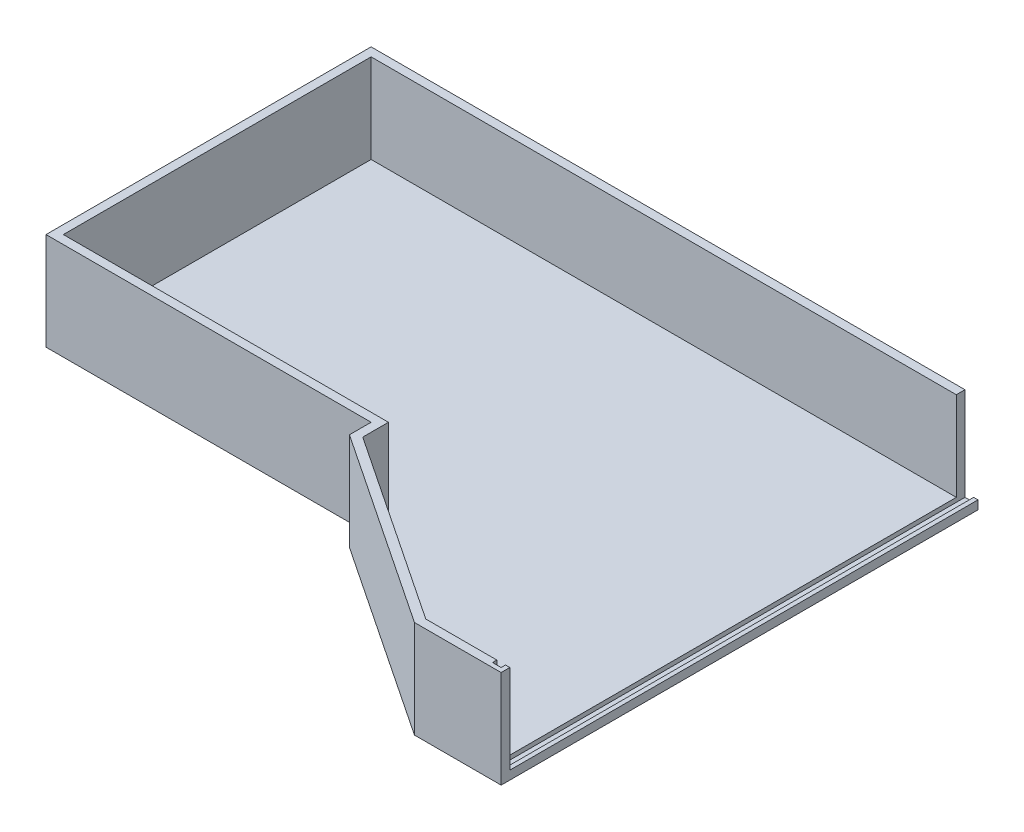
ISO-10303-21;
HEADER;
FILE_DESCRIPTION(('STEP AP214'),'2;1');
FILE_NAME('part.step','',(''),(''),'','','');
FILE_SCHEMA(('AUTOMOTIVE_DESIGN { 1 0 10303 214 1 1 1 1 }'));
ENDSEC;
DATA;
#1=APPLICATION_CONTEXT('core data for automotive mechanical design processes');
#2=APPLICATION_PROTOCOL_DEFINITION('international standard','automotive_design',2000,#1);
#3=PRODUCT_CONTEXT('',#1,'mechanical');
#4=PRODUCT('Part','Part','',(#3));
#5=PRODUCT_RELATED_PRODUCT_CATEGORY('part','',(#4));
#6=PRODUCT_DEFINITION_FORMATION('','',#4);
#7=PRODUCT_DEFINITION_CONTEXT('part definition',#1,'design');
#8=PRODUCT_DEFINITION('design','',#6,#7);
#9=PRODUCT_DEFINITION_SHAPE('','',#8);
#10=(LENGTH_UNIT() NAMED_UNIT(*) SI_UNIT(.MILLI.,.METRE.));
#11=(NAMED_UNIT(*) PLANE_ANGLE_UNIT() SI_UNIT($,.RADIAN.));
#12=(NAMED_UNIT(*) SI_UNIT($,.STERADIAN.) SOLID_ANGLE_UNIT());
#13=UNCERTAINTY_MEASURE_WITH_UNIT(LENGTH_MEASURE(1.E-05),#10,'distance_accuracy_value','');
#14=(GEOMETRIC_REPRESENTATION_CONTEXT(3) GLOBAL_UNCERTAINTY_ASSIGNED_CONTEXT((#13)) GLOBAL_UNIT_ASSIGNED_CONTEXT((#10,
#11,#12)) REPRESENTATION_CONTEXT('',''));
#15=CARTESIAN_POINT('',(0.,0.,0.));
#16=DIRECTION('',(0.,0.,1.));
#17=DIRECTION('',(1.,0.,0.));
#18=AXIS2_PLACEMENT_3D('',#15,#16,#17);
#19=CARTESIAN_POINT('',(0.,2.,0.));
#20=DIRECTION('',(0.,1.,0.));
#21=DIRECTION('',(0.,0.,1.));
#22=AXIS2_PLACEMENT_3D('',#19,#20,#21);
#23=PLANE('',#22);
#24=DIRECTION('',(0.,0.,-1.));
#25=VECTOR('',#24,1.);
#26=CARTESIAN_POINT('',(139.,2.,109.));
#27=LINE('',#26,#25);
#28=CARTESIAN_POINT('',(139.,2.,108.));
#29=VERTEX_POINT('',#28);
#30=CARTESIAN_POINT('',(139.,2.,0.));
#31=VERTEX_POINT('',#30);
#32=EDGE_CURVE('E352',#29,#31,#27,.T.);
#33=ORIENTED_EDGE('',*,*,#32,.F.);
#34=DIRECTION('',(1.,0.,0.));
#35=VECTOR('',#34,1.);
#36=CARTESIAN_POINT('',(120.605551275464,2.,108.));
#37=LINE('',#36,#35);
#38=CARTESIAN_POINT('',(140.,2.,108.));
#39=VERTEX_POINT('',#38);
#40=EDGE_CURVE('E295',#29,#39,#37,.T.);
#41=ORIENTED_EDGE('',*,*,#40,.T.);
#42=DIRECTION('',(0.,0.,1.));
#43=VECTOR('',#42,1.);
#44=CARTESIAN_POINT('',(140.,2.,0.));
#45=LINE('',#44,#43);
#46=CARTESIAN_POINT('',(140.,2.,0.));
#47=VERTEX_POINT('',#46);
#48=EDGE_CURVE('E376',#47,#39,#45,.T.);
#49=ORIENTED_EDGE('',*,*,#48,.F.);
#50=DIRECTION('',(1.,0.,0.));
#51=VECTOR('',#50,1.);
#52=CARTESIAN_POINT('',(0.,2.,0.));
#53=LINE('',#52,#51);
#54=EDGE_CURVE('E372',#31,#47,#53,.T.);
#55=ORIENTED_EDGE('',*,*,#54,.F.);
#56=EDGE_LOOP('',(#33,#41,#49,#55));
#57=FACE_BOUND('',#56,.T.);
#58=ADVANCED_FACE('F45',(#57),#23,.T.);
#59=CARTESIAN_POINT('',(120.605551275464,2.,108.));
#60=DIRECTION('',(0.,0.,1.));
#61=DIRECTION('',(1.,0.,0.));
#62=AXIS2_PLACEMENT_3D('',#59,#60,#61);
#63=PLANE('',#62);
#64=ORIENTED_EDGE('',*,*,#40,.F.);
#65=DIRECTION('',(0.,-1.,0.));
#66=VECTOR('',#65,1.);
#67=CARTESIAN_POINT('',(139.,2.,108.));
#68=LINE('',#67,#66);
#69=CARTESIAN_POINT('',(139.,22.5,108.));
#70=VERTEX_POINT('',#69);
#71=EDGE_CURVE('E420',#70,#29,#68,.T.);
#72=ORIENTED_EDGE('',*,*,#71,.F.);
#73=DIRECTION('',(1.,0.,0.));
#74=VECTOR('',#73,1.);
#75=CARTESIAN_POINT('',(120.605551275464,22.5,108.));
#76=LINE('',#75,#74);
#77=CARTESIAN_POINT('',(140.,22.5,108.));
#78=VERTEX_POINT('',#77);
#79=EDGE_CURVE('E208',#70,#78,#76,.T.);
#80=ORIENTED_EDGE('',*,*,#79,.T.);
#81=DIRECTION('',(0.,1.,0.));
#82=VECTOR('',#81,1.);
#83=CARTESIAN_POINT('',(140.,22.5,108.));
#84=LINE('',#83,#82);
#85=EDGE_CURVE('E204',#39,#78,#84,.T.);
#86=ORIENTED_EDGE('',*,*,#85,.F.);
#87=EDGE_LOOP('',(#64,#72,#80,#86));
#88=FACE_BOUND('',#87,.T.);
#89=ADVANCED_FACE('F461',(#88),#63,.F.);
#90=CARTESIAN_POINT('',(0.,22.5,75.));
#91=DIRECTION('',(1.,0.,0.));
#92=DIRECTION('',(0.,0.,-1.));
#93=AXIS2_PLACEMENT_3D('',#90,#91,#92);
#94=PLANE('',#93);
#95=DIRECTION('',(0.,0.,1.));
#96=VECTOR('',#95,1.);
#97=CARTESIAN_POINT('',(0.,0.,75.));
#98=LINE('',#97,#96);
#99=CARTESIAN_POINT('',(0.,0.,0.));
#100=VERTEX_POINT('',#99);
#101=CARTESIAN_POINT('',(0.,0.,75.));
#102=VERTEX_POINT('',#101);
#103=EDGE_CURVE('E157',#100,#102,#98,.T.);
#104=ORIENTED_EDGE('',*,*,#103,.T.);
#105=DIRECTION('',(0.,-1.,0.));
#106=VECTOR('',#105,1.);
#107=CARTESIAN_POINT('',(0.,22.5,75.));
#108=LINE('',#107,#106);
#109=CARTESIAN_POINT('',(0.,22.5,75.));
#110=VERTEX_POINT('',#109);
#111=EDGE_CURVE('E11',#110,#102,#108,.T.);
#112=ORIENTED_EDGE('',*,*,#111,.F.);
#113=DIRECTION('',(0.,0.,1.));
#114=VECTOR('',#113,1.);
#115=CARTESIAN_POINT('',(0.,22.5,75.));
#116=LINE('',#115,#114);
#117=CARTESIAN_POINT('',(0.,22.5,0.));
#118=VERTEX_POINT('',#117);
#119=EDGE_CURVE('E179',#118,#110,#116,.T.);
#120=ORIENTED_EDGE('',*,*,#119,.F.);
#121=DIRECTION('',(0.,-1.,0.));
#122=VECTOR('',#121,1.);
#123=CARTESIAN_POINT('',(0.,22.5,0.));
#124=LINE('',#123,#122);
#125=EDGE_CURVE('E156',#118,#100,#124,.T.);
#126=ORIENTED_EDGE('',*,*,#125,.T.);
#127=EDGE_LOOP('',(#104,#112,#120,#126));
#128=FACE_BOUND('',#127,.T.);
#129=ADVANCED_FACE('F47',(#128),#94,.F.);
#130=CARTESIAN_POINT('',(75.,22.5,75.));
#131=DIRECTION('',(0.,0.,-1.));
#132=DIRECTION('',(-1.,0.,0.));
#133=AXIS2_PLACEMENT_3D('',#130,#131,#132);
#134=PLANE('',#133);
#135=DIRECTION('',(1.,0.,0.));
#136=VECTOR('',#135,1.);
#137=CARTESIAN_POINT('',(75.,0.,75.));
#138=LINE('',#137,#136);
#139=CARTESIAN_POINT('',(75.,0.,75.));
#140=VERTEX_POINT('',#139);
#141=EDGE_CURVE('E161',#102,#140,#138,.T.);
#142=ORIENTED_EDGE('',*,*,#141,.T.);
#143=DIRECTION('',(0.,-1.,0.));
#144=VECTOR('',#143,1.);
#145=CARTESIAN_POINT('',(75.,22.5,75.));
#146=LINE('',#145,#144);
#147=CARTESIAN_POINT('',(75.,22.5,75.));
#148=VERTEX_POINT('',#147);
#149=EDGE_CURVE('E54',#148,#140,#146,.T.);
#150=ORIENTED_EDGE('',*,*,#149,.F.);
#151=DIRECTION('',(1.,0.,0.));
#152=VECTOR('',#151,1.);
#153=CARTESIAN_POINT('',(75.,22.5,75.));
#154=LINE('',#153,#152);
#155=EDGE_CURVE('E108',#110,#148,#154,.T.);
#156=ORIENTED_EDGE('',*,*,#155,.F.);
#157=ORIENTED_EDGE('',*,*,#111,.T.);
#158=EDGE_LOOP('',(#142,#150,#156,#157));
#159=FACE_BOUND('',#158,.T.);
#160=ADVANCED_FACE('F469',(#159),#134,.F.);
#161=CARTESIAN_POINT('',(75.,22.5,80.));
#162=DIRECTION('',(1.,0.,0.));
#163=DIRECTION('',(0.,0.,-1.));
#164=AXIS2_PLACEMENT_3D('',#161,#162,#163);
#165=PLANE('',#164);
#166=DIRECTION('',(0.,0.,1.));
#167=VECTOR('',#166,1.);
#168=CARTESIAN_POINT('',(75.,0.,80.));
#169=LINE('',#168,#167);
#170=CARTESIAN_POINT('',(75.,0.,80.));
#171=VERTEX_POINT('',#170);
#172=EDGE_CURVE('E165',#140,#171,#169,.T.);
#173=ORIENTED_EDGE('',*,*,#172,.T.);
#174=DIRECTION('',(0.,-1.,0.));
#175=VECTOR('',#174,1.);
#176=CARTESIAN_POINT('',(75.,22.5,80.));
#177=LINE('',#176,#175);
#178=CARTESIAN_POINT('',(75.,22.5,80.));
#179=VERTEX_POINT('',#178);
#180=EDGE_CURVE('E141',#179,#171,#177,.T.);
#181=ORIENTED_EDGE('',*,*,#180,.F.);
#182=DIRECTION('',(0.,0.,1.));
#183=VECTOR('',#182,1.);
#184=CARTESIAN_POINT('',(75.,22.5,80.));
#185=LINE('',#184,#183);
#186=EDGE_CURVE('E127',#148,#179,#185,.T.);
#187=ORIENTED_EDGE('',*,*,#186,.F.);
#188=ORIENTED_EDGE('',*,*,#149,.T.);
#189=EDGE_LOOP('',(#173,#181,#187,#188));
#190=FACE_BOUND('',#189,.T.);
#191=ADVANCED_FACE('F192',(#190),#165,.F.);
#192=CARTESIAN_POINT('',(120.,22.5,110.));
#193=DIRECTION('',(0.554700196225229,0.,-0.832050294337843));
#194=DIRECTION('',(-0.832050294337844,0.,-0.554700196225229));
#195=AXIS2_PLACEMENT_3D('',#192,#193,#194);
#196=PLANE('',#195);
#197=DIRECTION('',(0.832050294337844,0.,0.554700196225229));
#198=VECTOR('',#197,1.);
#199=CARTESIAN_POINT('',(120.,0.,110.));
#200=LINE('',#199,#198);
#201=CARTESIAN_POINT('',(120.,0.,110.));
#202=VERTEX_POINT('',#201);
#203=EDGE_CURVE('E137',#171,#202,#200,.T.);
#204=ORIENTED_EDGE('',*,*,#203,.T.);
#205=DIRECTION('',(0.,-1.,0.));
#206=VECTOR('',#205,1.);
#207=CARTESIAN_POINT('',(120.,22.5,110.));
#208=LINE('',#207,#206);
#209=CARTESIAN_POINT('',(120.,22.5,110.));
#210=VERTEX_POINT('',#209);
#211=EDGE_CURVE('E134',#210,#202,#208,.T.);
#212=ORIENTED_EDGE('',*,*,#211,.F.);
#213=DIRECTION('',(0.832050294337844,0.,0.554700196225229));
#214=VECTOR('',#213,1.);
#215=CARTESIAN_POINT('',(120.,22.5,110.));
#216=LINE('',#215,#214);
#217=EDGE_CURVE('E118',#179,#210,#216,.T.);
#218=ORIENTED_EDGE('',*,*,#217,.F.);
#219=ORIENTED_EDGE('',*,*,#180,.T.);
#220=EDGE_LOOP('',(#204,#212,#218,#219));
#221=FACE_BOUND('',#220,.T.);
#222=ADVANCED_FACE('F135',(#221),#196,.F.);
#223=CARTESIAN_POINT('',(140.,22.5,110.));
#224=DIRECTION('',(0.,0.,-1.));
#225=DIRECTION('',(-1.,0.,0.));
#226=AXIS2_PLACEMENT_3D('',#223,#224,#225);
#227=PLANE('',#226);
#228=DIRECTION('',(1.,0.,0.));
#229=VECTOR('',#228,1.);
#230=CARTESIAN_POINT('',(140.,0.,110.));
#231=LINE('',#230,#229);
#232=CARTESIAN_POINT('',(140.,0.,110.));
#233=VERTEX_POINT('',#232);
#234=EDGE_CURVE('E170',#202,#233,#231,.T.);
#235=ORIENTED_EDGE('',*,*,#234,.T.);
#236=DIRECTION('',(0.,-1.,0.));
#237=VECTOR('',#236,1.);
#238=CARTESIAN_POINT('',(140.,22.5,110.));
#239=LINE('',#238,#237);
#240=CARTESIAN_POINT('',(140.,22.5,110.));
#241=VERTEX_POINT('',#240);
#242=EDGE_CURVE('E142',#241,#233,#239,.T.);
#243=ORIENTED_EDGE('',*,*,#242,.F.);
#244=DIRECTION('',(1.,0.,0.));
#245=VECTOR('',#244,1.);
#246=CARTESIAN_POINT('',(140.,22.5,110.));
#247=LINE('',#246,#245);
#248=EDGE_CURVE('E124',#210,#241,#247,.T.);
#249=ORIENTED_EDGE('',*,*,#248,.F.);
#250=ORIENTED_EDGE('',*,*,#211,.T.);
#251=EDGE_LOOP('',(#235,#243,#249,#250));
#252=FACE_BOUND('',#251,.T.);
#253=ADVANCED_FACE('F144',(#252),#227,.F.);
#254=CARTESIAN_POINT('',(140.,22.5,0.));
#255=DIRECTION('',(-1.,0.,0.));
#256=DIRECTION('',(0.,0.,1.));
#257=AXIS2_PLACEMENT_3D('',#254,#255,#256);
#258=PLANE('',#257);
#259=DIRECTION('',(0.,-1.,0.));
#260=VECTOR('',#259,1.);
#261=CARTESIAN_POINT('',(140.,22.5,0.));
#262=LINE('',#261,#260);
#263=CARTESIAN_POINT('',(140.,0.,0.));
#264=VERTEX_POINT('',#263);
#265=EDGE_CURVE('E182',#47,#264,#262,.T.);
#266=ORIENTED_EDGE('',*,*,#265,.F.);
#267=ORIENTED_EDGE('',*,*,#48,.T.);
#268=ORIENTED_EDGE('',*,*,#85,.T.);
#269=DIRECTION('',(0.,0.,-1.));
#270=VECTOR('',#269,1.);
#271=CARTESIAN_POINT('',(140.,22.5,0.));
#272=LINE('',#271,#270);
#273=EDGE_CURVE('E148',#241,#78,#272,.T.);
#274=ORIENTED_EDGE('',*,*,#273,.F.);
#275=ORIENTED_EDGE('',*,*,#242,.T.);
#276=DIRECTION('',(0.,0.,-1.));
#277=VECTOR('',#276,1.);
#278=CARTESIAN_POINT('',(140.,0.,0.));
#279=LINE('',#278,#277);
#280=EDGE_CURVE('E173',#233,#264,#279,.T.);
#281=ORIENTED_EDGE('',*,*,#280,.T.);
#282=EDGE_LOOP('',(#266,#267,#268,#274,#275,#281));
#283=FACE_BOUND('',#282,.T.);
#284=ADVANCED_FACE('F199',(#283),#258,.F.);
#285=CARTESIAN_POINT('',(0.,22.5,0.));
#286=DIRECTION('',(0.,0.,1.));
#287=DIRECTION('',(1.,0.,0.));
#288=AXIS2_PLACEMENT_3D('',#285,#286,#287);
#289=PLANE('',#288);
#290=DIRECTION('',(-1.,0.,0.));
#291=VECTOR('',#290,1.);
#292=CARTESIAN_POINT('',(139.,0.999999999999998,0.));
#293=LINE('',#292,#291);
#294=CARTESIAN_POINT('',(139.,0.999999999999998,0.));
#295=VERTEX_POINT('',#294);
#296=CARTESIAN_POINT('',(137.,0.999999999999998,0.));
#297=VERTEX_POINT('',#296);
#298=EDGE_CURVE('E427',#295,#297,#293,.T.);
#299=ORIENTED_EDGE('',*,*,#298,.F.);
#300=DIRECTION('',(0.,1.,0.));
#301=VECTOR('',#300,1.);
#302=CARTESIAN_POINT('',(139.,0.999999999999998,0.));
#303=LINE('',#302,#301);
#304=EDGE_CURVE('E413',#295,#31,#303,.T.);
#305=ORIENTED_EDGE('',*,*,#304,.T.);
#306=ORIENTED_EDGE('',*,*,#54,.T.);
#307=ORIENTED_EDGE('',*,*,#265,.T.);
#308=DIRECTION('',(-1.,0.,0.));
#309=VECTOR('',#308,1.);
#310=CARTESIAN_POINT('',(0.,0.,0.));
#311=LINE('',#310,#309);
#312=EDGE_CURVE('E100',#264,#100,#311,.T.);
#313=ORIENTED_EDGE('',*,*,#312,.T.);
#314=ORIENTED_EDGE('',*,*,#125,.F.);
#315=DIRECTION('',(-1.,0.,0.));
#316=VECTOR('',#315,1.);
#317=CARTESIAN_POINT('',(0.,22.5,0.));
#318=LINE('',#317,#316);
#319=CARTESIAN_POINT('',(137.,22.5,0.));
#320=VERTEX_POINT('',#319);
#321=EDGE_CURVE('E70',#320,#118,#318,.T.);
#322=ORIENTED_EDGE('',*,*,#321,.F.);
#323=DIRECTION('',(0.,-1.,0.));
#324=VECTOR('',#323,1.);
#325=CARTESIAN_POINT('',(137.,22.5,0.));
#326=LINE('',#325,#324);
#327=EDGE_CURVE('E363',#320,#297,#326,.T.);
#328=ORIENTED_EDGE('',*,*,#327,.T.);
#329=EDGE_LOOP('',(#299,#305,#306,#307,#313,#314,#322,#328));
#330=FACE_BOUND('',#329,.T.);
#331=ADVANCED_FACE('F431',(#330),#289,.F.);
#332=CARTESIAN_POINT('',(0.,22.5,0.));
#333=DIRECTION('',(0.,-1.,0.));
#334=DIRECTION('',(0.,0.,-1.));
#335=AXIS2_PLACEMENT_3D('',#332,#333,#334);
#336=PLANE('',#335);
#337=ORIENTED_EDGE('',*,*,#79,.F.);
#338=DIRECTION('',(0.,0.,-1.));
#339=VECTOR('',#338,1.);
#340=CARTESIAN_POINT('',(139.,22.5,109.));
#341=LINE('',#340,#339);
#342=CARTESIAN_POINT('',(139.,22.5,109.));
#343=VERTEX_POINT('',#342);
#344=EDGE_CURVE('E359',#343,#70,#341,.T.);
#345=ORIENTED_EDGE('',*,*,#344,.F.);
#346=DIRECTION('',(1.,0.,0.));
#347=VECTOR('',#346,1.);
#348=CARTESIAN_POINT('',(139.,22.5,109.));
#349=LINE('',#348,#347);
#350=CARTESIAN_POINT('',(137.,22.5,109.));
#351=VERTEX_POINT('',#350);
#352=EDGE_CURVE('E451',#351,#343,#349,.T.);
#353=ORIENTED_EDGE('',*,*,#352,.F.);
#354=DIRECTION('',(0.,0.,-1.));
#355=VECTOR('',#354,1.);
#356=CARTESIAN_POINT('',(137.,22.5,109.));
#357=LINE('',#356,#355);
#358=CARTESIAN_POINT('',(137.,22.5,108.));
#359=VERTEX_POINT('',#358);
#360=EDGE_CURVE('E268',#351,#359,#357,.T.);
#361=ORIENTED_EDGE('',*,*,#360,.T.);
#362=CARTESIAN_POINT('',(120.605551275464,22.5,108.));
#363=VERTEX_POINT('',#362);
#364=EDGE_CURVE('E252',#363,#359,#76,.T.);
#365=ORIENTED_EDGE('',*,*,#364,.F.);
#366=DIRECTION('',(0.832050294337844,0.,0.554700196225229));
#367=VECTOR('',#366,1.);
#368=CARTESIAN_POINT('',(77.,22.5,78.929632483024));
#369=LINE('',#368,#367);
#370=CARTESIAN_POINT('',(77.,22.5,78.929632483024));
#371=VERTEX_POINT('',#370);
#372=EDGE_CURVE('E259',#371,#363,#369,.T.);
#373=ORIENTED_EDGE('',*,*,#372,.F.);
#374=DIRECTION('',(0.,0.,1.));
#375=VECTOR('',#374,1.);
#376=CARTESIAN_POINT('',(77.,22.5,73.));
#377=LINE('',#376,#375);
#378=CARTESIAN_POINT('',(77.,22.5,73.));
#379=VERTEX_POINT('',#378);
#380=EDGE_CURVE('E263',#379,#371,#377,.T.);
#381=ORIENTED_EDGE('',*,*,#380,.F.);
#382=DIRECTION('',(1.,0.,0.));
#383=VECTOR('',#382,1.);
#384=CARTESIAN_POINT('',(2.,22.5,73.));
#385=LINE('',#384,#383);
#386=CARTESIAN_POINT('',(2.,22.5,73.));
#387=VERTEX_POINT('',#386);
#388=EDGE_CURVE('E321',#387,#379,#385,.T.);
#389=ORIENTED_EDGE('',*,*,#388,.F.);
#390=DIRECTION('',(0.,0.,1.));
#391=VECTOR('',#390,1.);
#392=CARTESIAN_POINT('',(2.,22.5,2.));
#393=LINE('',#392,#391);
#394=CARTESIAN_POINT('',(2.,22.5,2.));
#395=VERTEX_POINT('',#394);
#396=EDGE_CURVE('E317',#395,#387,#393,.T.);
#397=ORIENTED_EDGE('',*,*,#396,.F.);
#398=DIRECTION('',(-1.,0.,0.));
#399=VECTOR('',#398,1.);
#400=CARTESIAN_POINT('',(138.,22.5,2.));
#401=LINE('',#400,#399);
#402=CARTESIAN_POINT('',(137.,22.5,2.));
#403=VERTEX_POINT('',#402);
#404=EDGE_CURVE('E61',#403,#395,#401,.T.);
#405=ORIENTED_EDGE('',*,*,#404,.F.);
#406=DIRECTION('',(0.,0.,1.));
#407=VECTOR('',#406,1.);
#408=CARTESIAN_POINT('',(137.,22.5,-18.));
#409=LINE('',#408,#407);
#410=EDGE_CURVE('E357',#320,#403,#409,.T.);
#411=ORIENTED_EDGE('',*,*,#410,.F.);
#412=ORIENTED_EDGE('',*,*,#321,.T.);
#413=ORIENTED_EDGE('',*,*,#119,.T.);
#414=ORIENTED_EDGE('',*,*,#155,.T.);
#415=ORIENTED_EDGE('',*,*,#186,.T.);
#416=ORIENTED_EDGE('',*,*,#217,.T.);
#417=ORIENTED_EDGE('',*,*,#248,.T.);
#418=ORIENTED_EDGE('',*,*,#273,.T.);
#419=EDGE_LOOP('',(#337,#345,#353,#361,#365,#373,#381,#389,#397,#405,#411,#412,#413,#414,#415,
#416,#417,#418));
#420=FACE_BOUND('',#419,.T.);
#421=ADVANCED_FACE('F121',(#420),#336,.F.);
#422=CARTESIAN_POINT('',(0.,0.,0.));
#423=DIRECTION('',(0.,-1.,0.));
#424=DIRECTION('',(0.,0.,-1.));
#425=AXIS2_PLACEMENT_3D('',#422,#423,#424);
#426=PLANE('',#425);
#427=ORIENTED_EDGE('',*,*,#103,.F.);
#428=ORIENTED_EDGE('',*,*,#312,.F.);
#429=ORIENTED_EDGE('',*,*,#280,.F.);
#430=ORIENTED_EDGE('',*,*,#234,.F.);
#431=ORIENTED_EDGE('',*,*,#203,.F.);
#432=ORIENTED_EDGE('',*,*,#172,.F.);
#433=ORIENTED_EDGE('',*,*,#141,.F.);
#434=EDGE_LOOP('',(#427,#428,#429,#430,#431,#432,#433));
#435=FACE_BOUND('',#434,.T.);
#436=ADVANCED_FACE('F195',(#435),#426,.T.);
#437=CARTESIAN_POINT('',(138.,2.,2.));
#438=DIRECTION('',(0.,0.,-1.));
#439=DIRECTION('',(-1.,0.,0.));
#440=AXIS2_PLACEMENT_3D('',#437,#438,#439);
#441=PLANE('',#440);
#442=DIRECTION('',(-1.,0.,0.));
#443=VECTOR('',#442,1.);
#444=CARTESIAN_POINT('',(138.,2.,2.));
#445=LINE('',#444,#443);
#446=CARTESIAN_POINT('',(137.,2.,2.));
#447=VERTEX_POINT('',#446);
#448=CARTESIAN_POINT('',(2.,2.,2.));
#449=VERTEX_POINT('',#448);
#450=EDGE_CURVE('E270',#447,#449,#445,.T.);
#451=ORIENTED_EDGE('',*,*,#450,.F.);
#452=DIRECTION('',(0.,-1.,0.));
#453=VECTOR('',#452,1.);
#454=CARTESIAN_POINT('',(137.,22.5,2.));
#455=LINE('',#454,#453);
#456=EDGE_CURVE('E340',#403,#447,#455,.T.);
#457=ORIENTED_EDGE('',*,*,#456,.F.);
#458=ORIENTED_EDGE('',*,*,#404,.T.);
#459=DIRECTION('',(0.,1.,0.));
#460=VECTOR('',#459,1.);
#461=CARTESIAN_POINT('',(2.,2.,2.));
#462=LINE('',#461,#460);
#463=EDGE_CURVE('E286',#449,#395,#462,.T.);
#464=ORIENTED_EDGE('',*,*,#463,.F.);
#465=EDGE_LOOP('',(#451,#457,#458,#464));
#466=FACE_BOUND('',#465,.T.);
#467=ADVANCED_FACE('F336',(#466),#441,.F.);
#468=ORIENTED_EDGE('',*,*,#364,.T.);
#469=DIRECTION('',(0.,1.,0.));
#470=VECTOR('',#469,1.);
#471=CARTESIAN_POINT('',(137.,2.,108.));
#472=LINE('',#471,#470);
#473=CARTESIAN_POINT('',(137.,2.,108.));
#474=VERTEX_POINT('',#473);
#475=EDGE_CURVE('E447',#474,#359,#472,.T.);
#476=ORIENTED_EDGE('',*,*,#475,.F.);
#477=CARTESIAN_POINT('',(120.605551275464,2.,108.));
#478=VERTEX_POINT('',#477);
#479=EDGE_CURVE('E254',#478,#474,#37,.T.);
#480=ORIENTED_EDGE('',*,*,#479,.F.);
#481=DIRECTION('',(0.,1.,0.));
#482=VECTOR('',#481,1.);
#483=CARTESIAN_POINT('',(120.605551275464,2.,108.));
#484=LINE('',#483,#482);
#485=EDGE_CURVE('E162',#478,#363,#484,.T.);
#486=ORIENTED_EDGE('',*,*,#485,.T.);
#487=EDGE_LOOP('',(#468,#476,#480,#486));
#488=FACE_BOUND('',#487,.T.);
#489=ADVANCED_FACE('F248',(#488),#63,.F.);
#490=CARTESIAN_POINT('',(77.,2.,78.929632483024));
#491=DIRECTION('',(-0.554700196225229,0.,0.832050294337844));
#492=DIRECTION('',(0.832050294337844,0.,0.554700196225229));
#493=AXIS2_PLACEMENT_3D('',#490,#491,#492);
#494=PLANE('',#493);
#495=ORIENTED_EDGE('',*,*,#372,.T.);
#496=ORIENTED_EDGE('',*,*,#485,.F.);
#497=DIRECTION('',(0.832050294337844,0.,0.554700196225229));
#498=VECTOR('',#497,1.);
#499=CARTESIAN_POINT('',(77.,2.,78.929632483024));
#500=LINE('',#499,#498);
#501=CARTESIAN_POINT('',(77.,2.,78.929632483024));
#502=VERTEX_POINT('',#501);
#503=EDGE_CURVE('E298',#502,#478,#500,.T.);
#504=ORIENTED_EDGE('',*,*,#503,.F.);
#505=DIRECTION('',(0.,1.,0.));
#506=VECTOR('',#505,1.);
#507=CARTESIAN_POINT('',(77.,2.,78.929632483024));
#508=LINE('',#507,#506);
#509=EDGE_CURVE('E242',#502,#371,#508,.T.);
#510=ORIENTED_EDGE('',*,*,#509,.T.);
#511=EDGE_LOOP('',(#495,#496,#504,#510));
#512=FACE_BOUND('',#511,.T.);
#513=ADVANCED_FACE('F260',(#512),#494,.F.);
#514=CARTESIAN_POINT('',(77.,2.,73.));
#515=DIRECTION('',(-1.,0.,0.));
#516=DIRECTION('',(0.,0.,1.));
#517=AXIS2_PLACEMENT_3D('',#514,#515,#516);
#518=PLANE('',#517);
#519=ORIENTED_EDGE('',*,*,#380,.T.);
#520=ORIENTED_EDGE('',*,*,#509,.F.);
#521=DIRECTION('',(0.,0.,1.));
#522=VECTOR('',#521,1.);
#523=CARTESIAN_POINT('',(77.,2.,73.));
#524=LINE('',#523,#522);
#525=CARTESIAN_POINT('',(77.,2.,73.));
#526=VERTEX_POINT('',#525);
#527=EDGE_CURVE('E300',#526,#502,#524,.T.);
#528=ORIENTED_EDGE('',*,*,#527,.F.);
#529=DIRECTION('',(0.,1.,0.));
#530=VECTOR('',#529,1.);
#531=CARTESIAN_POINT('',(77.,2.,73.));
#532=LINE('',#531,#530);
#533=EDGE_CURVE('E280',#526,#379,#532,.T.);
#534=ORIENTED_EDGE('',*,*,#533,.T.);
#535=EDGE_LOOP('',(#519,#520,#528,#534));
#536=FACE_BOUND('',#535,.T.);
#537=ADVANCED_FACE('F326',(#536),#518,.F.);
#538=CARTESIAN_POINT('',(2.,2.,73.));
#539=DIRECTION('',(0.,0.,1.));
#540=DIRECTION('',(1.,0.,0.));
#541=AXIS2_PLACEMENT_3D('',#538,#539,#540);
#542=PLANE('',#541);
#543=ORIENTED_EDGE('',*,*,#388,.T.);
#544=ORIENTED_EDGE('',*,*,#533,.F.);
#545=DIRECTION('',(1.,0.,0.));
#546=VECTOR('',#545,1.);
#547=CARTESIAN_POINT('',(2.,2.,73.));
#548=LINE('',#547,#546);
#549=CARTESIAN_POINT('',(2.,2.,73.));
#550=VERTEX_POINT('',#549);
#551=EDGE_CURVE('E304',#550,#526,#548,.T.);
#552=ORIENTED_EDGE('',*,*,#551,.F.);
#553=DIRECTION('',(0.,1.,0.));
#554=VECTOR('',#553,1.);
#555=CARTESIAN_POINT('',(2.,2.,73.));
#556=LINE('',#555,#554);
#557=EDGE_CURVE('E283',#550,#387,#556,.T.);
#558=ORIENTED_EDGE('',*,*,#557,.T.);
#559=EDGE_LOOP('',(#543,#544,#552,#558));
#560=FACE_BOUND('',#559,.T.);
#561=ADVANCED_FACE('F331',(#560),#542,.F.);
#562=CARTESIAN_POINT('',(2.,2.,2.));
#563=DIRECTION('',(-1.,0.,0.));
#564=DIRECTION('',(0.,0.,1.));
#565=AXIS2_PLACEMENT_3D('',#562,#563,#564);
#566=PLANE('',#565);
#567=ORIENTED_EDGE('',*,*,#396,.T.);
#568=ORIENTED_EDGE('',*,*,#557,.F.);
#569=DIRECTION('',(0.,0.,1.));
#570=VECTOR('',#569,1.);
#571=CARTESIAN_POINT('',(2.,2.,2.));
#572=LINE('',#571,#570);
#573=EDGE_CURVE('E274',#449,#550,#572,.T.);
#574=ORIENTED_EDGE('',*,*,#573,.F.);
#575=ORIENTED_EDGE('',*,*,#463,.T.);
#576=EDGE_LOOP('',(#567,#568,#574,#575));
#577=FACE_BOUND('',#576,.T.);
#578=ADVANCED_FACE('F334',(#577),#566,.F.);
#579=DIRECTION('',(0.,0.,1.));
#580=VECTOR('',#579,1.);
#581=CARTESIAN_POINT('',(137.,2.,109.));
#582=LINE('',#581,#580);
#583=EDGE_CURVE('E347',#447,#474,#582,.T.);
#584=ORIENTED_EDGE('',*,*,#583,.F.);
#585=ORIENTED_EDGE('',*,*,#450,.T.);
#586=ORIENTED_EDGE('',*,*,#573,.T.);
#587=ORIENTED_EDGE('',*,*,#551,.T.);
#588=ORIENTED_EDGE('',*,*,#527,.T.);
#589=ORIENTED_EDGE('',*,*,#503,.T.);
#590=ORIENTED_EDGE('',*,*,#479,.T.);
#591=EDGE_LOOP('',(#584,#585,#586,#587,#588,#589,#590));
#592=FACE_BOUND('',#591,.T.);
#593=ADVANCED_FACE('F345',(#592),#23,.T.);
#594=CARTESIAN_POINT('',(137.,22.5,-18.));
#595=DIRECTION('',(-1.,0.,0.));
#596=DIRECTION('',(0.,0.,1.));
#597=AXIS2_PLACEMENT_3D('',#594,#595,#596);
#598=PLANE('',#597);
#599=ORIENTED_EDGE('',*,*,#410,.T.);
#600=ORIENTED_EDGE('',*,*,#456,.T.);
#601=ORIENTED_EDGE('',*,*,#583,.T.);
#602=ORIENTED_EDGE('',*,*,#475,.T.);
#603=ORIENTED_EDGE('',*,*,#360,.F.);
#604=DIRECTION('',(0.,1.,0.));
#605=VECTOR('',#604,1.);
#606=CARTESIAN_POINT('',(137.,2.,109.));
#607=LINE('',#606,#605);
#608=CARTESIAN_POINT('',(137.,0.999999999999998,109.));
#609=VERTEX_POINT('',#608);
#610=EDGE_CURVE('E446',#609,#351,#607,.T.);
#611=ORIENTED_EDGE('',*,*,#610,.F.);
#612=DIRECTION('',(0.,0.,1.));
#613=VECTOR('',#612,1.);
#614=CARTESIAN_POINT('',(137.,0.999999999999998,109.));
#615=LINE('',#614,#613);
#616=EDGE_CURVE('E434',#297,#609,#615,.T.);
#617=ORIENTED_EDGE('',*,*,#616,.F.);
#618=ORIENTED_EDGE('',*,*,#327,.F.);
#619=EDGE_LOOP('',(#599,#600,#601,#602,#603,#611,#617,#618));
#620=FACE_BOUND('',#619,.T.);
#621=ADVANCED_FACE('F355',(#620),#598,.F.);
#622=CARTESIAN_POINT('',(139.,2.,109.));
#623=DIRECTION('',(1.,0.,0.));
#624=DIRECTION('',(0.,0.,-1.));
#625=AXIS2_PLACEMENT_3D('',#622,#623,#624);
#626=PLANE('',#625);
#627=ORIENTED_EDGE('',*,*,#71,.T.);
#628=ORIENTED_EDGE('',*,*,#32,.T.);
#629=ORIENTED_EDGE('',*,*,#304,.F.);
#630=DIRECTION('',(0.,0.,-1.));
#631=VECTOR('',#630,1.);
#632=CARTESIAN_POINT('',(139.,0.999999999999998,109.));
#633=LINE('',#632,#631);
#634=CARTESIAN_POINT('',(139.,0.999999999999998,109.));
#635=VERTEX_POINT('',#634);
#636=EDGE_CURVE('E351',#635,#295,#633,.T.);
#637=ORIENTED_EDGE('',*,*,#636,.F.);
#638=DIRECTION('',(0.,-1.,0.));
#639=VECTOR('',#638,1.);
#640=CARTESIAN_POINT('',(139.,2.,109.));
#641=LINE('',#640,#639);
#642=EDGE_CURVE('E443',#343,#635,#641,.T.);
#643=ORIENTED_EDGE('',*,*,#642,.F.);
#644=ORIENTED_EDGE('',*,*,#344,.T.);
#645=EDGE_LOOP('',(#627,#628,#629,#637,#643,#644));
#646=FACE_BOUND('',#645,.T.);
#647=ADVANCED_FACE('F416',(#646),#626,.F.);
#648=CARTESIAN_POINT('',(0.,0.,109.));
#649=DIRECTION('',(0.,0.,1.));
#650=DIRECTION('',(1.,0.,0.));
#651=AXIS2_PLACEMENT_3D('',#648,#649,#650);
#652=PLANE('',#651);
#653=ORIENTED_EDGE('',*,*,#642,.T.);
#654=DIRECTION('',(1.,0.,0.));
#655=VECTOR('',#654,1.);
#656=CARTESIAN_POINT('',(139.,0.999999999999998,109.));
#657=LINE('',#656,#655);
#658=EDGE_CURVE('E421',#609,#635,#657,.T.);
#659=ORIENTED_EDGE('',*,*,#658,.F.);
#660=ORIENTED_EDGE('',*,*,#610,.T.);
#661=ORIENTED_EDGE('',*,*,#352,.T.);
#662=EDGE_LOOP('',(#653,#659,#660,#661));
#663=FACE_BOUND('',#662,.T.);
#664=ADVANCED_FACE('F460',(#663),#652,.F.);
#665=CARTESIAN_POINT('',(0.,0.999999999999998,0.));
#666=DIRECTION('',(0.,1.,0.));
#667=DIRECTION('',(0.,0.,1.));
#668=AXIS2_PLACEMENT_3D('',#665,#666,#667);
#669=PLANE('',#668);
#670=ORIENTED_EDGE('',*,*,#636,.T.);
#671=ORIENTED_EDGE('',*,*,#298,.T.);
#672=ORIENTED_EDGE('',*,*,#616,.T.);
#673=ORIENTED_EDGE('',*,*,#658,.T.);
#674=EDGE_LOOP('',(#670,#671,#672,#673));
#675=FACE_BOUND('',#674,.T.);
#676=ADVANCED_FACE('F425',(#675),#669,.T.);
#677=CLOSED_SHELL('',(#58,#89,#129,#160,#191,#222,#253,#284,#331,#421,#436,#467,#489,#513,#537,
#561,#578,#593,#621,#647,#664,#676));
#678=MANIFOLD_SOLID_BREP('B2',#677);
#679=ADVANCED_BREP_SHAPE_REPRESENTATION('',(#18,#678),#14);
#680=SHAPE_DEFINITION_REPRESENTATION(#9,#679);
ENDSEC;
END-ISO-10303-21;
